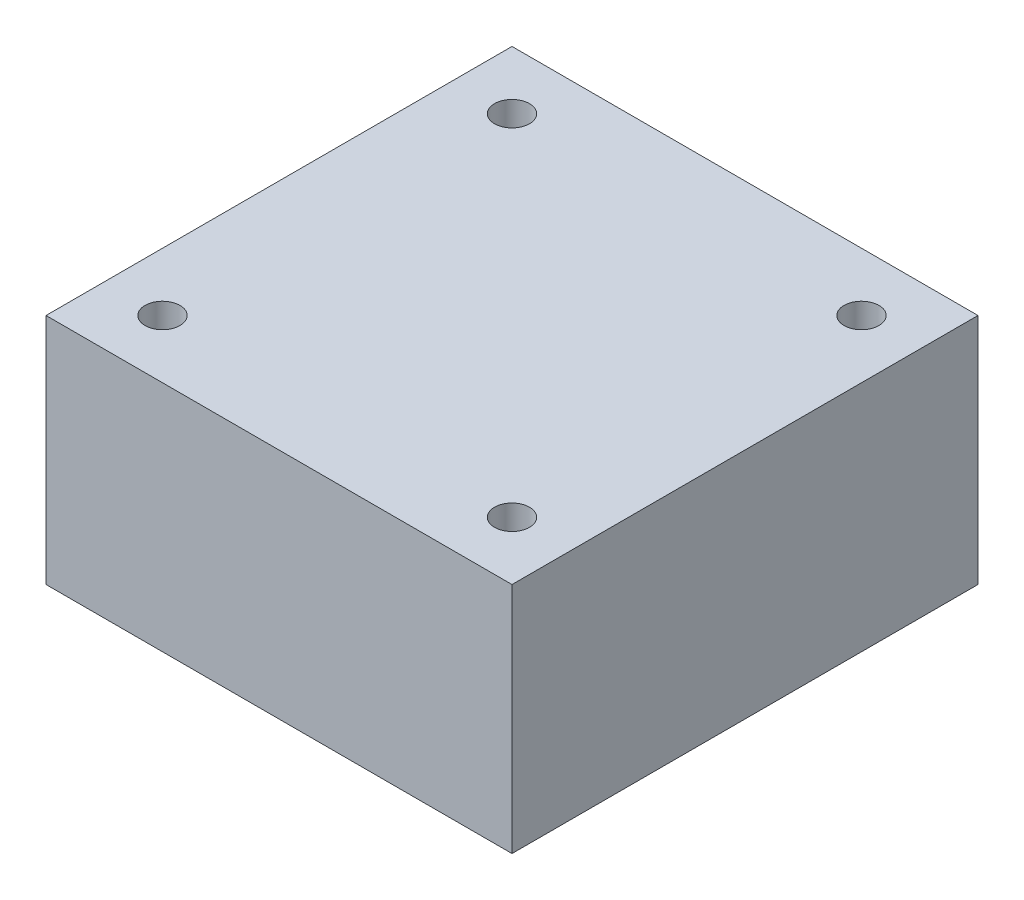
ISO-10303-21;
HEADER;
FILE_DESCRIPTION(('STEP AP214'),'2;1');
FILE_NAME('part.step','',(''),(''),'','','');
FILE_SCHEMA(('AUTOMOTIVE_DESIGN { 1 0 10303 214 1 1 1 1 }'));
ENDSEC;
DATA;
#1=APPLICATION_CONTEXT('core data for automotive mechanical design processes');
#2=APPLICATION_PROTOCOL_DEFINITION('international standard','automotive_design',2000,#1);
#3=PRODUCT_CONTEXT('',#1,'mechanical');
#4=PRODUCT('Part','Part','',(#3));
#5=PRODUCT_RELATED_PRODUCT_CATEGORY('part','',(#4));
#6=PRODUCT_DEFINITION_FORMATION('','',#4);
#7=PRODUCT_DEFINITION_CONTEXT('part definition',#1,'design');
#8=PRODUCT_DEFINITION('design','',#6,#7);
#9=PRODUCT_DEFINITION_SHAPE('','',#8);
#10=(LENGTH_UNIT() NAMED_UNIT(*) SI_UNIT(.MILLI.,.METRE.));
#11=(NAMED_UNIT(*) PLANE_ANGLE_UNIT() SI_UNIT($,.RADIAN.));
#12=(NAMED_UNIT(*) SI_UNIT($,.STERADIAN.) SOLID_ANGLE_UNIT());
#13=UNCERTAINTY_MEASURE_WITH_UNIT(LENGTH_MEASURE(1.E-05),#10,'distance_accuracy_value','');
#14=(GEOMETRIC_REPRESENTATION_CONTEXT(3) GLOBAL_UNCERTAINTY_ASSIGNED_CONTEXT((#13)) GLOBAL_UNIT_ASSIGNED_CONTEXT((#10,
#11,#12)) REPRESENTATION_CONTEXT('',''));
#15=CARTESIAN_POINT('',(0.,0.,0.));
#16=DIRECTION('',(0.,0.,1.));
#17=DIRECTION('',(1.,0.,0.));
#18=AXIS2_PLACEMENT_3D('',#15,#16,#17);
#19=CARTESIAN_POINT('',(-20.,20.,0.));
#20=DIRECTION('',(-1.,0.,0.));
#21=DIRECTION('',(0.,0.,1.));
#22=AXIS2_PLACEMENT_3D('',#19,#20,#21);
#23=PLANE('',#22);
#24=DIRECTION('',(0.,0.,-1.));
#25=VECTOR('',#24,1.);
#26=CARTESIAN_POINT('',(-20.,0.,0.));
#27=LINE('',#26,#25);
#28=CARTESIAN_POINT('',(-20.,0.,20.));
#29=VERTEX_POINT('',#28);
#30=CARTESIAN_POINT('',(-20.,0.,-20.));
#31=VERTEX_POINT('',#30);
#32=EDGE_CURVE('E113',#29,#31,#27,.T.);
#33=ORIENTED_EDGE('',*,*,#32,.F.);
#34=DIRECTION('',(0.,-1.,0.));
#35=VECTOR('',#34,1.);
#36=CARTESIAN_POINT('',(-20.,20.,20.));
#37=LINE('',#36,#35);
#38=CARTESIAN_POINT('',(-20.,20.,20.));
#39=VERTEX_POINT('',#38);
#40=EDGE_CURVE('E11',#39,#29,#37,.T.);
#41=ORIENTED_EDGE('',*,*,#40,.F.);
#42=DIRECTION('',(0.,0.,-1.));
#43=VECTOR('',#42,1.);
#44=CARTESIAN_POINT('',(-20.,20.,0.));
#45=LINE('',#44,#43);
#46=CARTESIAN_POINT('',(-20.,20.,-20.));
#47=VERTEX_POINT('',#46);
#48=EDGE_CURVE('E94',#39,#47,#45,.T.);
#49=ORIENTED_EDGE('',*,*,#48,.T.);
#50=DIRECTION('',(0.,-1.,0.));
#51=VECTOR('',#50,1.);
#52=CARTESIAN_POINT('',(-20.,20.,-20.));
#53=LINE('',#52,#51);
#54=EDGE_CURVE('E73',#47,#31,#53,.T.);
#55=ORIENTED_EDGE('',*,*,#54,.T.);
#56=EDGE_LOOP('',(#33,#41,#49,#55));
#57=FACE_BOUND('',#56,.T.);
#58=ADVANCED_FACE('F33',(#57),#23,.T.);
#59=CARTESIAN_POINT('',(0.,20.,20.));
#60=DIRECTION('',(0.,0.,1.));
#61=DIRECTION('',(1.,0.,0.));
#62=AXIS2_PLACEMENT_3D('',#59,#60,#61);
#63=PLANE('',#62);
#64=DIRECTION('',(-1.,0.,0.));
#65=VECTOR('',#64,1.);
#66=CARTESIAN_POINT('',(0.,0.,20.));
#67=LINE('',#66,#65);
#68=CARTESIAN_POINT('',(20.,0.,20.));
#69=VERTEX_POINT('',#68);
#70=EDGE_CURVE('E85',#69,#29,#67,.T.);
#71=ORIENTED_EDGE('',*,*,#70,.F.);
#72=DIRECTION('',(0.,-1.,0.));
#73=VECTOR('',#72,1.);
#74=CARTESIAN_POINT('',(20.,20.,20.));
#75=LINE('',#74,#73);
#76=CARTESIAN_POINT('',(20.,20.,20.));
#77=VERTEX_POINT('',#76);
#78=EDGE_CURVE('E42',#77,#69,#75,.T.);
#79=ORIENTED_EDGE('',*,*,#78,.F.);
#80=DIRECTION('',(-1.,0.,0.));
#81=VECTOR('',#80,1.);
#82=CARTESIAN_POINT('',(0.,20.,20.));
#83=LINE('',#82,#81);
#84=EDGE_CURVE('E83',#77,#39,#83,.T.);
#85=ORIENTED_EDGE('',*,*,#84,.T.);
#86=ORIENTED_EDGE('',*,*,#40,.T.);
#87=EDGE_LOOP('',(#71,#79,#85,#86));
#88=FACE_BOUND('',#87,.T.);
#89=ADVANCED_FACE('F81',(#88),#63,.T.);
#90=CARTESIAN_POINT('',(20.,20.,0.));
#91=DIRECTION('',(-1.,0.,0.));
#92=DIRECTION('',(0.,0.,1.));
#93=AXIS2_PLACEMENT_3D('',#90,#91,#92);
#94=PLANE('',#93);
#95=DIRECTION('',(0.,0.,-1.));
#96=VECTOR('',#95,1.);
#97=CARTESIAN_POINT('',(20.,0.,0.));
#98=LINE('',#97,#96);
#99=CARTESIAN_POINT('',(20.,0.,-20.));
#100=VERTEX_POINT('',#99);
#101=EDGE_CURVE('E116',#69,#100,#98,.T.);
#102=ORIENTED_EDGE('',*,*,#101,.T.);
#103=DIRECTION('',(0.,-1.,0.));
#104=VECTOR('',#103,1.);
#105=CARTESIAN_POINT('',(20.,20.,-20.));
#106=LINE('',#105,#104);
#107=CARTESIAN_POINT('',(20.,20.,-20.));
#108=VERTEX_POINT('',#107);
#109=EDGE_CURVE('E88',#108,#100,#106,.T.);
#110=ORIENTED_EDGE('',*,*,#109,.F.);
#111=DIRECTION('',(0.,0.,-1.));
#112=VECTOR('',#111,1.);
#113=CARTESIAN_POINT('',(20.,20.,0.));
#114=LINE('',#113,#112);
#115=EDGE_CURVE('E90',#77,#108,#114,.T.);
#116=ORIENTED_EDGE('',*,*,#115,.F.);
#117=ORIENTED_EDGE('',*,*,#78,.T.);
#118=EDGE_LOOP('',(#102,#110,#116,#117));
#119=FACE_BOUND('',#118,.T.);
#120=ADVANCED_FACE('F91',(#119),#94,.F.);
#121=CARTESIAN_POINT('',(15.,20.,15.));
#122=DIRECTION('',(0.,-1.,0.));
#123=DIRECTION('',(0.,0.,-1.));
#124=AXIS2_PLACEMENT_3D('',#121,#122,#123);
#125=CYLINDRICAL_SURFACE('',#124,1.5);
#126=CARTESIAN_POINT('',(15.,20.,15.));
#127=DIRECTION('',(0.,1.,0.));
#128=DIRECTION('',(0.,0.,1.));
#129=AXIS2_PLACEMENT_3D('',#126,#127,#128);
#130=CIRCLE('',#129,1.5);
#131=CARTESIAN_POINT('',(15.,20.,16.5));
#132=VERTEX_POINT('',#131);
#133=EDGE_CURVE('E96',#132,#132,#130,.T.);
#134=ORIENTED_EDGE('',*,*,#133,.T.);
#135=EDGE_LOOP('',(#134));
#136=FACE_BOUND('',#135,.T.);
#137=CARTESIAN_POINT('',(15.,0.,15.));
#138=DIRECTION('',(0.,1.,0.));
#139=DIRECTION('',(0.,0.,1.));
#140=AXIS2_PLACEMENT_3D('',#137,#138,#139);
#141=CIRCLE('',#140,1.5);
#142=CARTESIAN_POINT('',(15.,0.,16.5));
#143=VERTEX_POINT('',#142);
#144=EDGE_CURVE('E110',#143,#143,#141,.T.);
#145=ORIENTED_EDGE('',*,*,#144,.F.);
#146=EDGE_LOOP('',(#145));
#147=FACE_BOUND('',#146,.T.);
#148=ADVANCED_FACE('F132',(#136,#147),#125,.F.);
#149=CARTESIAN_POINT('',(15.,20.,-15.));
#150=DIRECTION('',(0.,-1.,0.));
#151=DIRECTION('',(0.,0.,-1.));
#152=AXIS2_PLACEMENT_3D('',#149,#150,#151);
#153=CYLINDRICAL_SURFACE('',#152,1.5);
#154=CARTESIAN_POINT('',(15.,20.,-15.));
#155=DIRECTION('',(0.,1.,0.));
#156=DIRECTION('',(0.,0.,1.));
#157=AXIS2_PLACEMENT_3D('',#154,#155,#156);
#158=CIRCLE('',#157,1.5);
#159=CARTESIAN_POINT('',(15.,20.,-13.5));
#160=VERTEX_POINT('',#159);
#161=EDGE_CURVE('E238',#160,#160,#158,.T.);
#162=ORIENTED_EDGE('',*,*,#161,.T.);
#163=EDGE_LOOP('',(#162));
#164=FACE_BOUND('',#163,.T.);
#165=CARTESIAN_POINT('',(15.,0.,-15.));
#166=DIRECTION('',(0.,1.,0.));
#167=DIRECTION('',(0.,0.,1.));
#168=AXIS2_PLACEMENT_3D('',#165,#166,#167);
#169=CIRCLE('',#168,1.5);
#170=CARTESIAN_POINT('',(15.,0.,-13.5));
#171=VERTEX_POINT('',#170);
#172=EDGE_CURVE('E107',#171,#171,#169,.T.);
#173=ORIENTED_EDGE('',*,*,#172,.F.);
#174=EDGE_LOOP('',(#173));
#175=FACE_BOUND('',#174,.T.);
#176=ADVANCED_FACE('F135',(#164,#175),#153,.F.);
#177=CARTESIAN_POINT('',(-15.,20.,15.));
#178=DIRECTION('',(0.,-1.,0.));
#179=DIRECTION('',(0.,0.,-1.));
#180=AXIS2_PLACEMENT_3D('',#177,#178,#179);
#181=CYLINDRICAL_SURFACE('',#180,1.5);
#182=CARTESIAN_POINT('',(-15.,20.,15.));
#183=DIRECTION('',(0.,1.,0.));
#184=DIRECTION('',(0.,0.,1.));
#185=AXIS2_PLACEMENT_3D('',#182,#183,#184);
#186=CIRCLE('',#185,1.5);
#187=CARTESIAN_POINT('',(-15.,20.,16.5));
#188=VERTEX_POINT('',#187);
#189=EDGE_CURVE('E149',#188,#188,#186,.T.);
#190=ORIENTED_EDGE('',*,*,#189,.T.);
#191=EDGE_LOOP('',(#190));
#192=FACE_BOUND('',#191,.T.);
#193=CARTESIAN_POINT('',(-15.,0.,15.));
#194=DIRECTION('',(0.,1.,0.));
#195=DIRECTION('',(0.,0.,1.));
#196=AXIS2_PLACEMENT_3D('',#193,#194,#195);
#197=CIRCLE('',#196,1.5);
#198=CARTESIAN_POINT('',(-15.,0.,16.5));
#199=VERTEX_POINT('',#198);
#200=EDGE_CURVE('E104',#199,#199,#197,.T.);
#201=ORIENTED_EDGE('',*,*,#200,.F.);
#202=EDGE_LOOP('',(#201));
#203=FACE_BOUND('',#202,.T.);
#204=ADVANCED_FACE('F138',(#192,#203),#181,.F.);
#205=CARTESIAN_POINT('',(-15.,20.,-15.));
#206=DIRECTION('',(0.,-1.,0.));
#207=DIRECTION('',(0.,0.,-1.));
#208=AXIS2_PLACEMENT_3D('',#205,#206,#207);
#209=CYLINDRICAL_SURFACE('',#208,1.5);
#210=CARTESIAN_POINT('',(-15.,20.,-15.));
#211=DIRECTION('',(0.,1.,0.));
#212=DIRECTION('',(0.,0.,1.));
#213=AXIS2_PLACEMENT_3D('',#210,#211,#212);
#214=CIRCLE('',#213,1.5);
#215=CARTESIAN_POINT('',(-15.,20.,-13.5));
#216=VERTEX_POINT('',#215);
#217=EDGE_CURVE('E119',#216,#216,#214,.T.);
#218=ORIENTED_EDGE('',*,*,#217,.T.);
#219=EDGE_LOOP('',(#218));
#220=FACE_BOUND('',#219,.T.);
#221=CARTESIAN_POINT('',(-15.,0.,-15.));
#222=DIRECTION('',(0.,1.,0.));
#223=DIRECTION('',(0.,0.,1.));
#224=AXIS2_PLACEMENT_3D('',#221,#222,#223);
#225=CIRCLE('',#224,1.5);
#226=CARTESIAN_POINT('',(-15.,0.,-13.5));
#227=VERTEX_POINT('',#226);
#228=EDGE_CURVE('E101',#227,#227,#225,.T.);
#229=ORIENTED_EDGE('',*,*,#228,.F.);
#230=EDGE_LOOP('',(#229));
#231=FACE_BOUND('',#230,.T.);
#232=ADVANCED_FACE('F35',(#220,#231),#209,.F.);
#233=CARTESIAN_POINT('',(0.,20.,-20.));
#234=DIRECTION('',(0.,0.,1.));
#235=DIRECTION('',(1.,0.,0.));
#236=AXIS2_PLACEMENT_3D('',#233,#234,#235);
#237=PLANE('',#236);
#238=DIRECTION('',(-1.,0.,0.));
#239=VECTOR('',#238,1.);
#240=CARTESIAN_POINT('',(0.,0.,-20.));
#241=LINE('',#240,#239);
#242=EDGE_CURVE('E66',#100,#31,#241,.T.);
#243=ORIENTED_EDGE('',*,*,#242,.T.);
#244=ORIENTED_EDGE('',*,*,#54,.F.);
#245=DIRECTION('',(-1.,0.,0.));
#246=VECTOR('',#245,1.);
#247=CARTESIAN_POINT('',(0.,20.,-20.));
#248=LINE('',#247,#246);
#249=EDGE_CURVE('E50',#108,#47,#248,.T.);
#250=ORIENTED_EDGE('',*,*,#249,.F.);
#251=ORIENTED_EDGE('',*,*,#109,.T.);
#252=EDGE_LOOP('',(#243,#244,#250,#251));
#253=FACE_BOUND('',#252,.T.);
#254=ADVANCED_FACE('F122',(#253),#237,.F.);
#255=CARTESIAN_POINT('',(0.,20.,0.));
#256=DIRECTION('',(0.,1.,0.));
#257=DIRECTION('',(0.,0.,1.));
#258=AXIS2_PLACEMENT_3D('',#255,#256,#257);
#259=PLANE('',#258);
#260=ORIENTED_EDGE('',*,*,#217,.F.);
#261=EDGE_LOOP('',(#260));
#262=FACE_BOUND('',#261,.T.);
#263=ORIENTED_EDGE('',*,*,#189,.F.);
#264=EDGE_LOOP('',(#263));
#265=FACE_BOUND('',#264,.T.);
#266=ORIENTED_EDGE('',*,*,#161,.F.);
#267=EDGE_LOOP('',(#266));
#268=FACE_BOUND('',#267,.T.);
#269=ORIENTED_EDGE('',*,*,#133,.F.);
#270=EDGE_LOOP('',(#269));
#271=FACE_BOUND('',#270,.T.);
#272=ORIENTED_EDGE('',*,*,#48,.F.);
#273=ORIENTED_EDGE('',*,*,#84,.F.);
#274=ORIENTED_EDGE('',*,*,#115,.T.);
#275=ORIENTED_EDGE('',*,*,#249,.T.);
#276=EDGE_LOOP('',(#272,#273,#274,#275));
#277=FACE_BOUND('',#276,.T.);
#278=ADVANCED_FACE('F93',(#262,#265,#268,#271,#277),#259,.T.);
#279=CARTESIAN_POINT('',(0.,0.,0.));
#280=DIRECTION('',(0.,1.,0.));
#281=DIRECTION('',(0.,0.,1.));
#282=AXIS2_PLACEMENT_3D('',#279,#280,#281);
#283=PLANE('',#282);
#284=ORIENTED_EDGE('',*,*,#228,.T.);
#285=EDGE_LOOP('',(#284));
#286=FACE_BOUND('',#285,.T.);
#287=ORIENTED_EDGE('',*,*,#200,.T.);
#288=EDGE_LOOP('',(#287));
#289=FACE_BOUND('',#288,.T.);
#290=ORIENTED_EDGE('',*,*,#172,.T.);
#291=EDGE_LOOP('',(#290));
#292=FACE_BOUND('',#291,.T.);
#293=ORIENTED_EDGE('',*,*,#144,.T.);
#294=EDGE_LOOP('',(#293));
#295=FACE_BOUND('',#294,.T.);
#296=ORIENTED_EDGE('',*,*,#32,.T.);
#297=ORIENTED_EDGE('',*,*,#242,.F.);
#298=ORIENTED_EDGE('',*,*,#101,.F.);
#299=ORIENTED_EDGE('',*,*,#70,.T.);
#300=EDGE_LOOP('',(#296,#297,#298,#299));
#301=FACE_BOUND('',#300,.T.);
#302=ADVANCED_FACE('F123',(#286,#289,#292,#295,#301),#283,.F.);
#303=CLOSED_SHELL('',(#58,#89,#120,#148,#176,#204,#232,#254,#278,#302));
#304=MANIFOLD_SOLID_BREP('B2',#303);
#305=ADVANCED_BREP_SHAPE_REPRESENTATION('',(#18,#304),#14);
#306=SHAPE_DEFINITION_REPRESENTATION(#9,#305);
ENDSEC;
END-ISO-10303-21;
